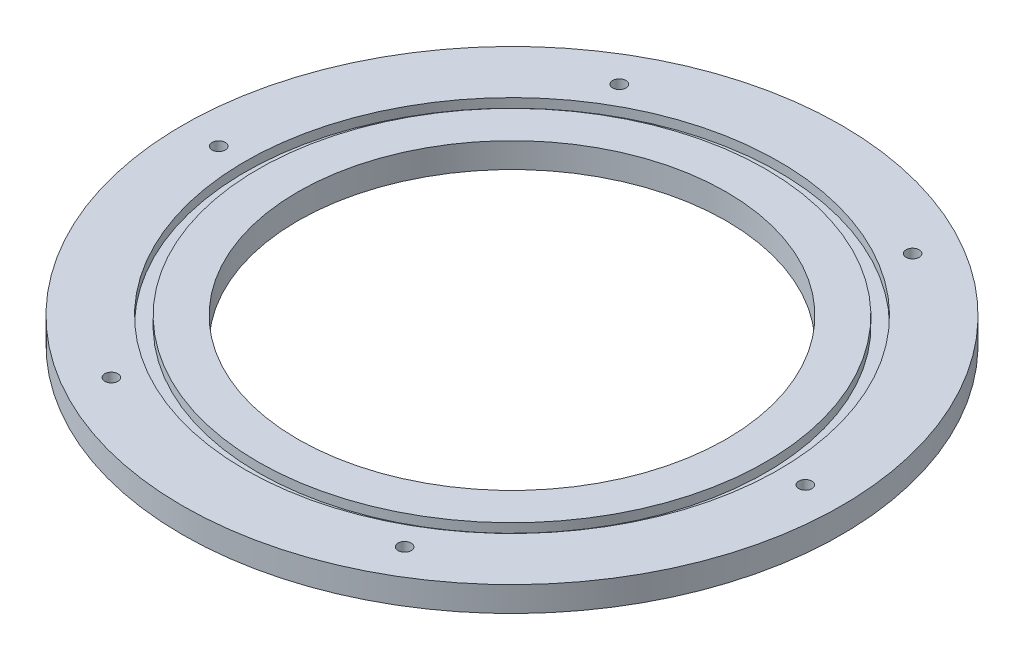
ISO-10303-21;
HEADER;
FILE_DESCRIPTION(('STEP AP214'),'2;1');
FILE_NAME('part.step','',(''),(''),'','','');
FILE_SCHEMA(('AUTOMOTIVE_DESIGN { 1 0 10303 214 1 1 1 1 }'));
ENDSEC;
DATA;
#1=APPLICATION_CONTEXT('core data for automotive mechanical design processes');
#2=APPLICATION_PROTOCOL_DEFINITION('international standard','automotive_design',2000,#1);
#3=PRODUCT_CONTEXT('',#1,'mechanical');
#4=PRODUCT('Part','Part','',(#3));
#5=PRODUCT_RELATED_PRODUCT_CATEGORY('part','',(#4));
#6=PRODUCT_DEFINITION_FORMATION('','',#4);
#7=PRODUCT_DEFINITION_CONTEXT('part definition',#1,'design');
#8=PRODUCT_DEFINITION('design','',#6,#7);
#9=PRODUCT_DEFINITION_SHAPE('','',#8);
#10=(LENGTH_UNIT() NAMED_UNIT(*) SI_UNIT(.MILLI.,.METRE.));
#11=(NAMED_UNIT(*) PLANE_ANGLE_UNIT() SI_UNIT($,.RADIAN.));
#12=(NAMED_UNIT(*) SI_UNIT($,.STERADIAN.) SOLID_ANGLE_UNIT());
#13=UNCERTAINTY_MEASURE_WITH_UNIT(LENGTH_MEASURE(1.E-05),#10,'distance_accuracy_value','');
#14=(GEOMETRIC_REPRESENTATION_CONTEXT(3) GLOBAL_UNCERTAINTY_ASSIGNED_CONTEXT((#13)) GLOBAL_UNIT_ASSIGNED_CONTEXT((#10,
#11,#12)) REPRESENTATION_CONTEXT('',''));
#15=CARTESIAN_POINT('',(0.,0.,0.));
#16=DIRECTION('',(0.,0.,1.));
#17=DIRECTION('',(1.,0.,0.));
#18=AXIS2_PLACEMENT_3D('',#15,#16,#17);
#19=CARTESIAN_POINT('',(0.,9.5,0.));
#20=DIRECTION('',(0.,1.,0.));
#21=DIRECTION('',(0.,0.,1.));
#22=AXIS2_PLACEMENT_3D('',#19,#20,#21);
#23=PLANE('',#22);
#24=CARTESIAN_POINT('',(0.,9.5,0.));
#25=DIRECTION('',(0.,1.,0.));
#26=DIRECTION('',(0.,0.,1.));
#27=AXIS2_PLACEMENT_3D('',#24,#25,#26);
#28=CIRCLE('',#27,162.5);
#29=CARTESIAN_POINT('',(0.,9.5,162.5));
#30=VERTEX_POINT('',#29);
#31=EDGE_CURVE('E49',#30,#30,#28,.T.);
#32=ORIENTED_EDGE('',*,*,#31,.F.);
#33=EDGE_LOOP('',(#32));
#34=FACE_BOUND('',#33,.T.);
#35=CARTESIAN_POINT('',(0.,9.5,0.));
#36=DIRECTION('',(0.,1.,0.));
#37=DIRECTION('',(0.,0.,1.));
#38=AXIS2_PLACEMENT_3D('',#35,#36,#37);
#39=CIRCLE('',#38,192.5);
#40=CARTESIAN_POINT('',(0.,9.5,192.5));
#41=VERTEX_POINT('',#40);
#42=EDGE_CURVE('E67',#41,#41,#39,.T.);
#43=ORIENTED_EDGE('',*,*,#42,.T.);
#44=EDGE_LOOP('',(#43));
#45=FACE_BOUND('',#44,.T.);
#46=ADVANCED_FACE('F36',(#34,#45),#23,.T.);
#47=CARTESIAN_POINT('',(111.25,9.5,192.690652342038));
#48=DIRECTION('',(0.,1.,0.));
#49=DIRECTION('',(0.,0.,-1.));
#50=AXIS2_PLACEMENT_3D('',#47,#48,#49);
#51=CIRCLE('',#50,5.00000000000001);
#52=CARTESIAN_POINT('',(111.25,9.5,187.690652342038));
#53=VERTEX_POINT('',#52);
#54=EDGE_CURVE('E99',#53,#53,#51,.T.);
#55=ORIENTED_EDGE('',*,*,#54,.F.);
#56=EDGE_LOOP('',(#55));
#57=FACE_BOUND('',#56,.T.);
#58=CARTESIAN_POINT('',(-222.5,9.5,1.55431223447522E-12));
#59=DIRECTION('',(0.,1.,0.));
#60=DIRECTION('',(0.,0.,-1.));
#61=AXIS2_PLACEMENT_3D('',#58,#59,#60);
#62=CIRCLE('',#61,4.99999999999992);
#63=CARTESIAN_POINT('',(-222.5,9.5,-4.99999999999837));
#64=VERTEX_POINT('',#63);
#65=EDGE_CURVE('E108',#64,#64,#62,.T.);
#66=ORIENTED_EDGE('',*,*,#65,.F.);
#67=EDGE_LOOP('',(#66));
#68=FACE_BOUND('',#67,.T.);
#69=CARTESIAN_POINT('',(-111.250000000001,9.5,-192.690652342037));
#70=DIRECTION('',(0.,1.,0.));
#71=DIRECTION('',(0.,0.,-1.));
#72=AXIS2_PLACEMENT_3D('',#69,#70,#71);
#73=CIRCLE('',#72,5.00000000000001);
#74=CARTESIAN_POINT('',(-111.250000000001,9.5,-197.690652342037));
#75=VERTEX_POINT('',#74);
#76=EDGE_CURVE('E83',#75,#75,#73,.T.);
#77=ORIENTED_EDGE('',*,*,#76,.F.);
#78=EDGE_LOOP('',(#77));
#79=FACE_BOUND('',#78,.T.);
#80=CARTESIAN_POINT('',(222.5,9.5,0.));
#81=DIRECTION('',(0.,1.,0.));
#82=DIRECTION('',(0.,0.,1.));
#83=AXIS2_PLACEMENT_3D('',#80,#81,#82);
#84=CIRCLE('',#83,4.99999999999999);
#85=CARTESIAN_POINT('',(222.5,9.5,4.99999999999999));
#86=VERTEX_POINT('',#85);
#87=EDGE_CURVE('E92',#86,#86,#84,.T.);
#88=ORIENTED_EDGE('',*,*,#87,.F.);
#89=EDGE_LOOP('',(#88));
#90=FACE_BOUND('',#89,.T.);
#91=CARTESIAN_POINT('',(-111.250000000001,9.5,192.690652342037));
#92=DIRECTION('',(0.,1.,0.));
#93=DIRECTION('',(0.,0.,1.));
#94=AXIS2_PLACEMENT_3D('',#91,#92,#93);
#95=CIRCLE('',#94,5.00000000000001);
#96=CARTESIAN_POINT('',(-111.250000000001,9.5,197.690652342037));
#97=VERTEX_POINT('',#96);
#98=EDGE_CURVE('E115',#97,#97,#95,.T.);
#99=ORIENTED_EDGE('',*,*,#98,.F.);
#100=EDGE_LOOP('',(#99));
#101=FACE_BOUND('',#100,.T.);
#102=CARTESIAN_POINT('',(111.25,9.5,-192.690652342038));
#103=DIRECTION('',(0.,1.,0.));
#104=DIRECTION('',(0.,0.,1.));
#105=AXIS2_PLACEMENT_3D('',#102,#103,#104);
#106=CIRCLE('',#105,5.00000000000001);
#107=CARTESIAN_POINT('',(111.25,9.5,-187.690652342038));
#108=VERTEX_POINT('',#107);
#109=EDGE_CURVE('E75',#108,#108,#106,.T.);
#110=ORIENTED_EDGE('',*,*,#109,.F.);
#111=EDGE_LOOP('',(#110));
#112=FACE_BOUND('',#111,.T.);
#113=CARTESIAN_POINT('',(0.,9.5,0.));
#114=DIRECTION('',(0.,1.,0.));
#115=DIRECTION('',(0.,0.,1.));
#116=AXIS2_PLACEMENT_3D('',#113,#114,#115);
#117=CIRCLE('',#116,202.5);
#118=CARTESIAN_POINT('',(0.,9.5,202.5));
#119=VERTEX_POINT('',#118);
#120=EDGE_CURVE('E59',#119,#119,#117,.T.);
#121=ORIENTED_EDGE('',*,*,#120,.F.);
#122=EDGE_LOOP('',(#121));
#123=FACE_BOUND('',#122,.T.);
#124=CARTESIAN_POINT('',(0.,9.5,0.));
#125=DIRECTION('',(0.,1.,0.));
#126=DIRECTION('',(0.,0.,1.));
#127=AXIS2_PLACEMENT_3D('',#124,#125,#126);
#128=CIRCLE('',#127,250.);
#129=CARTESIAN_POINT('',(0.,9.5,250.));
#130=VERTEX_POINT('',#129);
#131=EDGE_CURVE('E10',#130,#130,#128,.T.);
#132=ORIENTED_EDGE('',*,*,#131,.T.);
#133=EDGE_LOOP('',(#132));
#134=FACE_BOUND('',#133,.T.);
#135=ADVANCED_FACE('F134',(#57,#68,#79,#90,#101,#112,#123,#134),#23,.T.);
#136=CARTESIAN_POINT('',(0.,-9.5,0.));
#137=DIRECTION('',(0.,1.,0.));
#138=DIRECTION('',(0.,0.,1.));
#139=AXIS2_PLACEMENT_3D('',#136,#137,#138);
#140=PLANE('',#139);
#141=CARTESIAN_POINT('',(111.25,-9.5,192.690652342038));
#142=DIRECTION('',(0.,1.,0.));
#143=DIRECTION('',(0.,0.,-1.));
#144=AXIS2_PLACEMENT_3D('',#141,#142,#143);
#145=CIRCLE('',#144,5.00000000000001);
#146=CARTESIAN_POINT('',(111.25,-9.5,187.690652342038));
#147=VERTEX_POINT('',#146);
#148=EDGE_CURVE('E103',#147,#147,#145,.T.);
#149=ORIENTED_EDGE('',*,*,#148,.T.);
#150=EDGE_LOOP('',(#149));
#151=FACE_BOUND('',#150,.T.);
#152=CARTESIAN_POINT('',(-222.5,-9.5,1.55431223447522E-12));
#153=DIRECTION('',(0.,1.,0.));
#154=DIRECTION('',(0.,0.,-1.));
#155=AXIS2_PLACEMENT_3D('',#152,#153,#154);
#156=CIRCLE('',#155,4.99999999999992);
#157=CARTESIAN_POINT('',(-222.5,-9.5,-4.99999999999837));
#158=VERTEX_POINT('',#157);
#159=EDGE_CURVE('E88',#158,#158,#156,.T.);
#160=ORIENTED_EDGE('',*,*,#159,.T.);
#161=EDGE_LOOP('',(#160));
#162=FACE_BOUND('',#161,.T.);
#163=CARTESIAN_POINT('',(-111.250000000001,-9.5,-192.690652342037));
#164=DIRECTION('',(0.,1.,0.));
#165=DIRECTION('',(0.,0.,-1.));
#166=AXIS2_PLACEMENT_3D('',#163,#164,#165);
#167=CIRCLE('',#166,5.00000000000001);
#168=CARTESIAN_POINT('',(-111.250000000001,-9.5,-197.690652342037));
#169=VERTEX_POINT('',#168);
#170=EDGE_CURVE('E87',#169,#169,#167,.T.);
#171=ORIENTED_EDGE('',*,*,#170,.T.);
#172=EDGE_LOOP('',(#171));
#173=FACE_BOUND('',#172,.T.);
#174=CARTESIAN_POINT('',(222.5,-9.5,0.));
#175=DIRECTION('',(0.,1.,0.));
#176=DIRECTION('',(0.,0.,1.));
#177=AXIS2_PLACEMENT_3D('',#174,#175,#176);
#178=CIRCLE('',#177,4.99999999999999);
#179=CARTESIAN_POINT('',(222.5,-9.5,4.99999999999999));
#180=VERTEX_POINT('',#179);
#181=EDGE_CURVE('E79',#180,#180,#178,.T.);
#182=ORIENTED_EDGE('',*,*,#181,.T.);
#183=EDGE_LOOP('',(#182));
#184=FACE_BOUND('',#183,.T.);
#185=CARTESIAN_POINT('',(-111.250000000001,-9.5,192.690652342037));
#186=DIRECTION('',(0.,1.,0.));
#187=DIRECTION('',(0.,0.,1.));
#188=AXIS2_PLACEMENT_3D('',#185,#186,#187);
#189=CIRCLE('',#188,5.00000000000001);
#190=CARTESIAN_POINT('',(-111.250000000001,-9.5,197.690652342037));
#191=VERTEX_POINT('',#190);
#192=EDGE_CURVE('E104',#191,#191,#189,.T.);
#193=ORIENTED_EDGE('',*,*,#192,.T.);
#194=EDGE_LOOP('',(#193));
#195=FACE_BOUND('',#194,.T.);
#196=CARTESIAN_POINT('',(111.25,-9.5,-192.690652342038));
#197=DIRECTION('',(0.,1.,0.));
#198=DIRECTION('',(0.,0.,1.));
#199=AXIS2_PLACEMENT_3D('',#196,#197,#198);
#200=CIRCLE('',#199,5.00000000000001);
#201=CARTESIAN_POINT('',(111.25,-9.5,-187.690652342038));
#202=VERTEX_POINT('',#201);
#203=EDGE_CURVE('E71',#202,#202,#200,.T.);
#204=ORIENTED_EDGE('',*,*,#203,.T.);
#205=EDGE_LOOP('',(#204));
#206=FACE_BOUND('',#205,.T.);
#207=CARTESIAN_POINT('',(0.,-9.5,0.));
#208=DIRECTION('',(0.,1.,0.));
#209=DIRECTION('',(0.,0.,1.));
#210=AXIS2_PLACEMENT_3D('',#207,#208,#209);
#211=CIRCLE('',#210,250.);
#212=CARTESIAN_POINT('',(0.,-9.5,250.));
#213=VERTEX_POINT('',#212);
#214=EDGE_CURVE('E40',#213,#213,#211,.T.);
#215=ORIENTED_EDGE('',*,*,#214,.F.);
#216=EDGE_LOOP('',(#215));
#217=FACE_BOUND('',#216,.T.);
#218=CARTESIAN_POINT('',(0.,-9.5,0.));
#219=DIRECTION('',(0.,1.,0.));
#220=DIRECTION('',(0.,0.,1.));
#221=AXIS2_PLACEMENT_3D('',#218,#219,#220);
#222=CIRCLE('',#221,162.5);
#223=CARTESIAN_POINT('',(0.,-9.5,162.5));
#224=VERTEX_POINT('',#223);
#225=EDGE_CURVE('E51',#224,#224,#222,.T.);
#226=ORIENTED_EDGE('',*,*,#225,.T.);
#227=EDGE_LOOP('',(#226));
#228=FACE_BOUND('',#227,.T.);
#229=ADVANCED_FACE('F123',(#151,#162,#173,#184,#195,#206,#217,#228),#140,.F.);
#230=CARTESIAN_POINT('',(0.,9.5,0.));
#231=DIRECTION('',(0.,-1.,0.));
#232=DIRECTION('',(0.,0.,-1.));
#233=AXIS2_PLACEMENT_3D('',#230,#231,#232);
#234=CYLINDRICAL_SURFACE('',#233,250.);
#235=ORIENTED_EDGE('',*,*,#131,.F.);
#236=EDGE_LOOP('',(#235));
#237=FACE_BOUND('',#236,.T.);
#238=ORIENTED_EDGE('',*,*,#214,.T.);
#239=EDGE_LOOP('',(#238));
#240=FACE_BOUND('',#239,.T.);
#241=ADVANCED_FACE('F38',(#237,#240),#234,.T.);
#242=CARTESIAN_POINT('',(0.,9.5,0.));
#243=DIRECTION('',(0.,-1.,0.));
#244=DIRECTION('',(0.,0.,-1.));
#245=AXIS2_PLACEMENT_3D('',#242,#243,#244);
#246=CYLINDRICAL_SURFACE('',#245,162.5);
#247=ORIENTED_EDGE('',*,*,#31,.T.);
#248=EDGE_LOOP('',(#247));
#249=FACE_BOUND('',#248,.T.);
#250=ORIENTED_EDGE('',*,*,#225,.F.);
#251=EDGE_LOOP('',(#250));
#252=FACE_BOUND('',#251,.T.);
#253=ADVANCED_FACE('F146',(#249,#252),#246,.F.);
#254=CARTESIAN_POINT('',(0.,2.5,0.));
#255=DIRECTION('',(0.,1.,0.));
#256=DIRECTION('',(0.,0.,1.));
#257=AXIS2_PLACEMENT_3D('',#254,#255,#256);
#258=CYLINDRICAL_SURFACE('',#257,202.5);
#259=CARTESIAN_POINT('',(0.,2.5,0.));
#260=DIRECTION('',(0.,1.,0.));
#261=DIRECTION('',(0.,0.,1.));
#262=AXIS2_PLACEMENT_3D('',#259,#260,#261);
#263=CIRCLE('',#262,202.5);
#264=CARTESIAN_POINT('',(0.,2.5,202.5));
#265=VERTEX_POINT('',#264);
#266=EDGE_CURVE('E55',#265,#265,#263,.T.);
#267=ORIENTED_EDGE('',*,*,#266,.F.);
#268=EDGE_LOOP('',(#267));
#269=FACE_BOUND('',#268,.T.);
#270=ORIENTED_EDGE('',*,*,#120,.T.);
#271=EDGE_LOOP('',(#270));
#272=FACE_BOUND('',#271,.T.);
#273=ADVANCED_FACE('F143',(#269,#272),#258,.F.);
#274=CARTESIAN_POINT('',(0.,2.5,0.));
#275=DIRECTION('',(0.,1.,0.));
#276=DIRECTION('',(0.,0.,1.));
#277=AXIS2_PLACEMENT_3D('',#274,#275,#276);
#278=PLANE('',#277);
#279=CARTESIAN_POINT('',(0.,2.5,0.));
#280=DIRECTION('',(0.,1.,0.));
#281=DIRECTION('',(0.,0.,1.));
#282=AXIS2_PLACEMENT_3D('',#279,#280,#281);
#283=CIRCLE('',#282,192.5);
#284=CARTESIAN_POINT('',(0.,2.5,192.5));
#285=VERTEX_POINT('',#284);
#286=EDGE_CURVE('E63',#285,#285,#283,.T.);
#287=ORIENTED_EDGE('',*,*,#286,.F.);
#288=EDGE_LOOP('',(#287));
#289=FACE_BOUND('',#288,.T.);
#290=ORIENTED_EDGE('',*,*,#266,.T.);
#291=EDGE_LOOP('',(#290));
#292=FACE_BOUND('',#291,.T.);
#293=ADVANCED_FACE('F145',(#289,#292),#278,.T.);
#294=CARTESIAN_POINT('',(0.,2.5,0.));
#295=DIRECTION('',(0.,1.,0.));
#296=DIRECTION('',(0.,0.,1.));
#297=AXIS2_PLACEMENT_3D('',#294,#295,#296);
#298=CYLINDRICAL_SURFACE('',#297,192.5);
#299=ORIENTED_EDGE('',*,*,#286,.T.);
#300=EDGE_LOOP('',(#299));
#301=FACE_BOUND('',#300,.T.);
#302=ORIENTED_EDGE('',*,*,#42,.F.);
#303=EDGE_LOOP('',(#302));
#304=FACE_BOUND('',#303,.T.);
#305=ADVANCED_FACE('F153',(#301,#304),#298,.T.);
#306=CARTESIAN_POINT('',(111.25,-9.5,-192.690652342038));
#307=DIRECTION('',(0.,1.,0.));
#308=DIRECTION('',(0.,0.,1.));
#309=AXIS2_PLACEMENT_3D('',#306,#307,#308);
#310=CYLINDRICAL_SURFACE('',#309,5.00000000000001);
#311=ORIENTED_EDGE('',*,*,#203,.F.);
#312=EDGE_LOOP('',(#311));
#313=FACE_BOUND('',#312,.T.);
#314=ORIENTED_EDGE('',*,*,#109,.T.);
#315=EDGE_LOOP('',(#314));
#316=FACE_BOUND('',#315,.T.);
#317=ADVANCED_FACE('F130',(#313,#316),#310,.F.);
#318=CARTESIAN_POINT('',(-111.250000000001,-9.5,192.690652342037));
#319=DIRECTION('',(0.,1.,0.));
#320=DIRECTION('',(0.,0.,1.));
#321=AXIS2_PLACEMENT_3D('',#318,#319,#320);
#322=CYLINDRICAL_SURFACE('',#321,5.00000000000001);
#323=ORIENTED_EDGE('',*,*,#192,.F.);
#324=EDGE_LOOP('',(#323));
#325=FACE_BOUND('',#324,.T.);
#326=ORIENTED_EDGE('',*,*,#98,.T.);
#327=EDGE_LOOP('',(#326));
#328=FACE_BOUND('',#327,.T.);
#329=ADVANCED_FACE('F126',(#325,#328),#322,.F.);
#330=CARTESIAN_POINT('',(222.5,-9.5,0.));
#331=DIRECTION('',(0.,1.,0.));
#332=DIRECTION('',(0.,0.,1.));
#333=AXIS2_PLACEMENT_3D('',#330,#331,#332);
#334=CYLINDRICAL_SURFACE('',#333,4.99999999999999);
#335=ORIENTED_EDGE('',*,*,#181,.F.);
#336=EDGE_LOOP('',(#335));
#337=FACE_BOUND('',#336,.T.);
#338=ORIENTED_EDGE('',*,*,#87,.T.);
#339=EDGE_LOOP('',(#338));
#340=FACE_BOUND('',#339,.T.);
#341=ADVANCED_FACE('F129',(#337,#340),#334,.F.);
#342=CARTESIAN_POINT('',(-111.250000000001,-9.5,-192.690652342037));
#343=DIRECTION('',(0.,1.,0.));
#344=DIRECTION('',(0.,0.,1.));
#345=AXIS2_PLACEMENT_3D('',#342,#343,#344);
#346=CYLINDRICAL_SURFACE('',#345,5.00000000000001);
#347=ORIENTED_EDGE('',*,*,#170,.F.);
#348=EDGE_LOOP('',(#347));
#349=FACE_BOUND('',#348,.T.);
#350=ORIENTED_EDGE('',*,*,#76,.T.);
#351=EDGE_LOOP('',(#350));
#352=FACE_BOUND('',#351,.T.);
#353=ADVANCED_FACE('F181',(#349,#352),#346,.F.);
#354=CARTESIAN_POINT('',(-222.5,-9.5,1.55431223447522E-12));
#355=DIRECTION('',(0.,1.,0.));
#356=DIRECTION('',(0.,0.,1.));
#357=AXIS2_PLACEMENT_3D('',#354,#355,#356);
#358=CYLINDRICAL_SURFACE('',#357,4.99999999999992);
#359=ORIENTED_EDGE('',*,*,#159,.F.);
#360=EDGE_LOOP('',(#359));
#361=FACE_BOUND('',#360,.T.);
#362=ORIENTED_EDGE('',*,*,#65,.T.);
#363=EDGE_LOOP('',(#362));
#364=FACE_BOUND('',#363,.T.);
#365=ADVANCED_FACE('F188',(#361,#364),#358,.F.);
#366=CARTESIAN_POINT('',(111.25,-9.5,192.690652342038));
#367=DIRECTION('',(0.,1.,0.));
#368=DIRECTION('',(0.,0.,1.));
#369=AXIS2_PLACEMENT_3D('',#366,#367,#368);
#370=CYLINDRICAL_SURFACE('',#369,5.00000000000001);
#371=ORIENTED_EDGE('',*,*,#148,.F.);
#372=EDGE_LOOP('',(#371));
#373=FACE_BOUND('',#372,.T.);
#374=ORIENTED_EDGE('',*,*,#54,.T.);
#375=EDGE_LOOP('',(#374));
#376=FACE_BOUND('',#375,.T.);
#377=ADVANCED_FACE('F192',(#373,#376),#370,.F.);
#378=CLOSED_SHELL('',(#46,#135,#229,#241,#253,#273,#293,#305,#317,#329,#341,#353,#365,#377));
#379=MANIFOLD_SOLID_BREP('B2',#378);
#380=ADVANCED_BREP_SHAPE_REPRESENTATION('',(#18,#379),#14);
#381=SHAPE_DEFINITION_REPRESENTATION(#9,#380);
ENDSEC;
END-ISO-10303-21;
